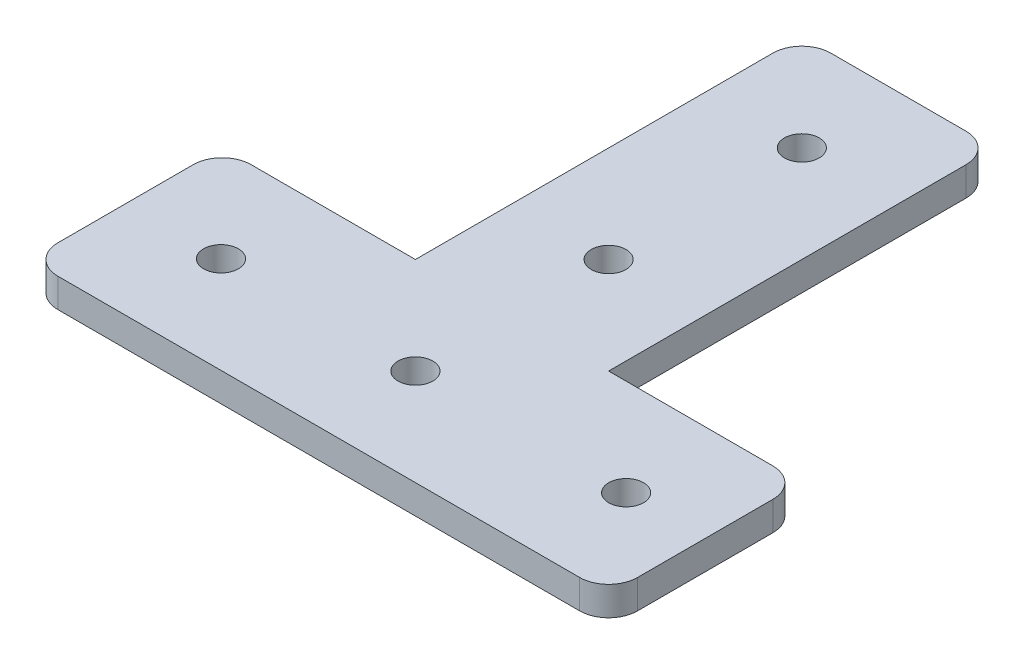
ISO-10303-21;
HEADER;
FILE_DESCRIPTION(('STEP AP214'),'2;1');
FILE_NAME('part.step','',(''),(''),'','','');
FILE_SCHEMA(('AUTOMOTIVE_DESIGN { 1 0 10303 214 1 1 1 1 }'));
ENDSEC;
DATA;
#1=APPLICATION_CONTEXT('core data for automotive mechanical design processes');
#2=APPLICATION_PROTOCOL_DEFINITION('international standard','automotive_design',2000,#1);
#3=PRODUCT_CONTEXT('',#1,'mechanical');
#4=PRODUCT('Part','Part','',(#3));
#5=PRODUCT_RELATED_PRODUCT_CATEGORY('part','',(#4));
#6=PRODUCT_DEFINITION_FORMATION('','',#4);
#7=PRODUCT_DEFINITION_CONTEXT('part definition',#1,'design');
#8=PRODUCT_DEFINITION('design','',#6,#7);
#9=PRODUCT_DEFINITION_SHAPE('','',#8);
#10=(LENGTH_UNIT() NAMED_UNIT(*) SI_UNIT(.MILLI.,.METRE.));
#11=(NAMED_UNIT(*) PLANE_ANGLE_UNIT() SI_UNIT($,.RADIAN.));
#12=(NAMED_UNIT(*) SI_UNIT($,.STERADIAN.) SOLID_ANGLE_UNIT());
#13=UNCERTAINTY_MEASURE_WITH_UNIT(LENGTH_MEASURE(1.E-05),#10,'distance_accuracy_value','');
#14=(GEOMETRIC_REPRESENTATION_CONTEXT(3) GLOBAL_UNCERTAINTY_ASSIGNED_CONTEXT((#13)) GLOBAL_UNIT_ASSIGNED_CONTEXT((#10,
#11,#12)) REPRESENTATION_CONTEXT('',''));
#15=CARTESIAN_POINT('',(0.,0.,0.));
#16=DIRECTION('',(0.,0.,1.));
#17=DIRECTION('',(1.,0.,0.));
#18=AXIS2_PLACEMENT_3D('',#15,#16,#17);
#19=CARTESIAN_POINT('',(10.,3.,0.));
#20=DIRECTION('',(1.,0.,0.));
#21=DIRECTION('',(0.,0.,-1.));
#22=AXIS2_PLACEMENT_3D('',#19,#20,#21);
#23=PLANE('',#22);
#24=DIRECTION('',(0.,0.,1.));
#25=VECTOR('',#24,1.);
#26=CARTESIAN_POINT('',(10.,0.,0.));
#27=LINE('',#26,#25);
#28=CARTESIAN_POINT('',(10.,0.,-47.));
#29=VERTEX_POINT('',#28);
#30=CARTESIAN_POINT('',(10.,0.,-10.));
#31=VERTEX_POINT('',#30);
#32=EDGE_CURVE('E351',#29,#31,#27,.T.);
#33=ORIENTED_EDGE('',*,*,#32,.F.);
#34=DIRECTION('',(0.,-1.,0.));
#35=VECTOR('',#34,1.);
#36=CARTESIAN_POINT('',(10.,3.,-47.));
#37=LINE('',#36,#35);
#38=CARTESIAN_POINT('',(10.,3.,-47.));
#39=VERTEX_POINT('',#38);
#40=EDGE_CURVE('E214',#29,#39,#37,.F.);
#41=ORIENTED_EDGE('',*,*,#40,.T.);
#42=DIRECTION('',(0.,0.,1.));
#43=VECTOR('',#42,1.);
#44=CARTESIAN_POINT('',(10.,3.,0.));
#45=LINE('',#44,#43);
#46=CARTESIAN_POINT('',(10.,3.,-10.));
#47=VERTEX_POINT('',#46);
#48=EDGE_CURVE('E317',#39,#47,#45,.T.);
#49=ORIENTED_EDGE('',*,*,#48,.T.);
#50=DIRECTION('',(0.,-1.,0.));
#51=VECTOR('',#50,1.);
#52=CARTESIAN_POINT('',(10.,3.,-10.));
#53=LINE('',#52,#51);
#54=EDGE_CURVE('E181',#47,#31,#53,.T.);
#55=ORIENTED_EDGE('',*,*,#54,.T.);
#56=EDGE_LOOP('',(#33,#41,#49,#55));
#57=FACE_BOUND('',#56,.T.);
#58=ADVANCED_FACE('F50',(#57),#23,.T.);
#59=CARTESIAN_POINT('',(0.,3.,-50.));
#60=DIRECTION('',(0.,0.,-1.));
#61=DIRECTION('',(-1.,0.,0.));
#62=AXIS2_PLACEMENT_3D('',#59,#60,#61);
#63=PLANE('',#62);
#64=DIRECTION('',(1.,0.,0.));
#65=VECTOR('',#64,1.);
#66=CARTESIAN_POINT('',(0.,3.,-50.));
#67=LINE('',#66,#65);
#68=CARTESIAN_POINT('',(-7.,3.,-50.));
#69=VERTEX_POINT('',#68);
#70=CARTESIAN_POINT('',(7.,3.,-50.));
#71=VERTEX_POINT('',#70);
#72=EDGE_CURVE('E175',#69,#71,#67,.T.);
#73=ORIENTED_EDGE('',*,*,#72,.T.);
#74=DIRECTION('',(0.,-1.,0.));
#75=VECTOR('',#74,1.);
#76=CARTESIAN_POINT('',(7.,3.,-50.));
#77=LINE('',#76,#75);
#78=CARTESIAN_POINT('',(7.,0.,-50.));
#79=VERTEX_POINT('',#78);
#80=EDGE_CURVE('E187',#71,#79,#77,.T.);
#81=ORIENTED_EDGE('',*,*,#80,.T.);
#82=DIRECTION('',(1.,0.,0.));
#83=VECTOR('',#82,1.);
#84=CARTESIAN_POINT('',(0.,0.,-50.));
#85=LINE('',#84,#83);
#86=CARTESIAN_POINT('',(-7.,0.,-50.));
#87=VERTEX_POINT('',#86);
#88=EDGE_CURVE('E353',#87,#79,#85,.T.);
#89=ORIENTED_EDGE('',*,*,#88,.F.);
#90=DIRECTION('',(0.,-1.,0.));
#91=VECTOR('',#90,1.);
#92=CARTESIAN_POINT('',(-7.,3.,-50.));
#93=LINE('',#92,#91);
#94=EDGE_CURVE('E185',#87,#69,#93,.F.);
#95=ORIENTED_EDGE('',*,*,#94,.T.);
#96=EDGE_LOOP('',(#73,#81,#89,#95));
#97=FACE_BOUND('',#96,.T.);
#98=ADVANCED_FACE('F385',(#97),#63,.T.);
#99=CARTESIAN_POINT('',(-10.,3.,0.));
#100=DIRECTION('',(1.,0.,0.));
#101=DIRECTION('',(0.,0.,-1.));
#102=AXIS2_PLACEMENT_3D('',#99,#100,#101);
#103=PLANE('',#102);
#104=DIRECTION('',(0.,0.,1.));
#105=VECTOR('',#104,1.);
#106=CARTESIAN_POINT('',(-10.,3.,0.));
#107=LINE('',#106,#105);
#108=CARTESIAN_POINT('',(-10.,3.,-47.));
#109=VERTEX_POINT('',#108);
#110=CARTESIAN_POINT('',(-10.,3.,-10.));
#111=VERTEX_POINT('',#110);
#112=EDGE_CURVE('E165',#109,#111,#107,.T.);
#113=ORIENTED_EDGE('',*,*,#112,.F.);
#114=DIRECTION('',(0.,-1.,0.));
#115=VECTOR('',#114,1.);
#116=CARTESIAN_POINT('',(-10.,0.,-47.));
#117=LINE('',#116,#115);
#118=CARTESIAN_POINT('',(-10.,0.,-47.));
#119=VERTEX_POINT('',#118);
#120=EDGE_CURVE('E11',#109,#119,#117,.T.);
#121=ORIENTED_EDGE('',*,*,#120,.T.);
#122=DIRECTION('',(0.,0.,1.));
#123=VECTOR('',#122,1.);
#124=CARTESIAN_POINT('',(-10.,0.,0.));
#125=LINE('',#124,#123);
#126=CARTESIAN_POINT('',(-10.,0.,-10.));
#127=VERTEX_POINT('',#126);
#128=EDGE_CURVE('E177',#119,#127,#125,.T.);
#129=ORIENTED_EDGE('',*,*,#128,.T.);
#130=DIRECTION('',(0.,-1.,0.));
#131=VECTOR('',#130,1.);
#132=CARTESIAN_POINT('',(-10.,3.,-10.));
#133=LINE('',#132,#131);
#134=EDGE_CURVE('E160',#111,#127,#133,.T.);
#135=ORIENTED_EDGE('',*,*,#134,.F.);
#136=EDGE_LOOP('',(#113,#121,#129,#135));
#137=FACE_BOUND('',#136,.T.);
#138=ADVANCED_FACE('F180',(#137),#103,.F.);
#139=CARTESIAN_POINT('',(0.,3.,-10.));
#140=DIRECTION('',(0.,0.,-1.));
#141=DIRECTION('',(-1.,0.,0.));
#142=AXIS2_PLACEMENT_3D('',#139,#140,#141);
#143=PLANE('',#142);
#144=DIRECTION('',(1.,0.,0.));
#145=VECTOR('',#144,1.);
#146=CARTESIAN_POINT('',(0.,0.,-10.));
#147=LINE('',#146,#145);
#148=CARTESIAN_POINT('',(-27.,0.,-10.));
#149=VERTEX_POINT('',#148);
#150=EDGE_CURVE('E294',#149,#127,#147,.T.);
#151=ORIENTED_EDGE('',*,*,#150,.F.);
#152=DIRECTION('',(0.,-1.,0.));
#153=VECTOR('',#152,1.);
#154=CARTESIAN_POINT('',(-27.,3.,-10.));
#155=LINE('',#154,#153);
#156=CARTESIAN_POINT('',(-27.,3.,-10.));
#157=VERTEX_POINT('',#156);
#158=EDGE_CURVE('E57',#149,#157,#155,.F.);
#159=ORIENTED_EDGE('',*,*,#158,.T.);
#160=DIRECTION('',(1.,0.,0.));
#161=VECTOR('',#160,1.);
#162=CARTESIAN_POINT('',(0.,3.,-10.));
#163=LINE('',#162,#161);
#164=EDGE_CURVE('E155',#157,#111,#163,.T.);
#165=ORIENTED_EDGE('',*,*,#164,.T.);
#166=ORIENTED_EDGE('',*,*,#134,.T.);
#167=EDGE_LOOP('',(#151,#159,#165,#166));
#168=FACE_BOUND('',#167,.T.);
#169=ADVANCED_FACE('F154',(#168),#143,.T.);
#170=CARTESIAN_POINT('',(-30.,3.,0.));
#171=DIRECTION('',(-1.,0.,0.));
#172=DIRECTION('',(0.,0.,1.));
#173=AXIS2_PLACEMENT_3D('',#170,#171,#172);
#174=PLANE('',#173);
#175=DIRECTION('',(0.,0.,-1.));
#176=VECTOR('',#175,1.);
#177=CARTESIAN_POINT('',(-30.,0.,0.));
#178=LINE('',#177,#176);
#179=CARTESIAN_POINT('',(-30.,0.,7.));
#180=VERTEX_POINT('',#179);
#181=CARTESIAN_POINT('',(-30.,0.,-7.));
#182=VERTEX_POINT('',#181);
#183=EDGE_CURVE('E266',#180,#182,#178,.T.);
#184=ORIENTED_EDGE('',*,*,#183,.F.);
#185=DIRECTION('',(0.,-1.,0.));
#186=VECTOR('',#185,1.);
#187=CARTESIAN_POINT('',(-30.,3.,7.));
#188=LINE('',#187,#186);
#189=CARTESIAN_POINT('',(-30.,3.,7.));
#190=VERTEX_POINT('',#189);
#191=EDGE_CURVE('E254',#180,#190,#188,.F.);
#192=ORIENTED_EDGE('',*,*,#191,.T.);
#193=DIRECTION('',(0.,0.,-1.));
#194=VECTOR('',#193,1.);
#195=CARTESIAN_POINT('',(-30.,3.,0.));
#196=LINE('',#195,#194);
#197=CARTESIAN_POINT('',(-30.,3.,-7.));
#198=VERTEX_POINT('',#197);
#199=EDGE_CURVE('E161',#190,#198,#196,.T.);
#200=ORIENTED_EDGE('',*,*,#199,.T.);
#201=DIRECTION('',(0.,-1.,0.));
#202=VECTOR('',#201,1.);
#203=CARTESIAN_POINT('',(-30.,3.,-7.));
#204=LINE('',#203,#202);
#205=EDGE_CURVE('E253',#198,#182,#204,.T.);
#206=ORIENTED_EDGE('',*,*,#205,.T.);
#207=EDGE_LOOP('',(#184,#192,#200,#206));
#208=FACE_BOUND('',#207,.T.);
#209=ADVANCED_FACE('F263',(#208),#174,.T.);
#210=CARTESIAN_POINT('',(0.,3.,10.));
#211=DIRECTION('',(0.,0.,-1.));
#212=DIRECTION('',(-1.,0.,0.));
#213=AXIS2_PLACEMENT_3D('',#210,#211,#212);
#214=PLANE('',#213);
#215=DIRECTION('',(1.,0.,0.));
#216=VECTOR('',#215,1.);
#217=CARTESIAN_POINT('',(0.,0.,10.));
#218=LINE('',#217,#216);
#219=CARTESIAN_POINT('',(-27.,0.,10.));
#220=VERTEX_POINT('',#219);
#221=CARTESIAN_POINT('',(27.,0.,10.));
#222=VERTEX_POINT('',#221);
#223=EDGE_CURVE('E278',#220,#222,#218,.T.);
#224=ORIENTED_EDGE('',*,*,#223,.T.);
#225=DIRECTION('',(0.,-1.,0.));
#226=VECTOR('',#225,1.);
#227=CARTESIAN_POINT('',(27.,3.,10.));
#228=LINE('',#227,#226);
#229=CARTESIAN_POINT('',(27.,3.,10.));
#230=VERTEX_POINT('',#229);
#231=EDGE_CURVE('E248',#222,#230,#228,.F.);
#232=ORIENTED_EDGE('',*,*,#231,.T.);
#233=DIRECTION('',(1.,0.,0.));
#234=VECTOR('',#233,1.);
#235=CARTESIAN_POINT('',(0.,3.,10.));
#236=LINE('',#235,#234);
#237=CARTESIAN_POINT('',(-27.,3.,10.));
#238=VERTEX_POINT('',#237);
#239=EDGE_CURVE('E275',#238,#230,#236,.T.);
#240=ORIENTED_EDGE('',*,*,#239,.F.);
#241=DIRECTION('',(0.,-1.,0.));
#242=VECTOR('',#241,1.);
#243=CARTESIAN_POINT('',(-27.,0.,10.));
#244=LINE('',#243,#242);
#245=EDGE_CURVE('E243',#238,#220,#244,.T.);
#246=ORIENTED_EDGE('',*,*,#245,.T.);
#247=EDGE_LOOP('',(#224,#232,#240,#246));
#248=FACE_BOUND('',#247,.T.);
#249=ADVANCED_FACE('F276',(#248),#214,.F.);
#250=CARTESIAN_POINT('',(30.,3.,0.));
#251=DIRECTION('',(-1.,0.,0.));
#252=DIRECTION('',(0.,0.,1.));
#253=AXIS2_PLACEMENT_3D('',#250,#251,#252);
#254=PLANE('',#253);
#255=DIRECTION('',(0.,0.,-1.));
#256=VECTOR('',#255,1.);
#257=CARTESIAN_POINT('',(30.,0.,0.));
#258=LINE('',#257,#256);
#259=CARTESIAN_POINT('',(30.,0.,7.));
#260=VERTEX_POINT('',#259);
#261=CARTESIAN_POINT('',(30.,0.,-7.));
#262=VERTEX_POINT('',#261);
#263=EDGE_CURVE('E288',#260,#262,#258,.T.);
#264=ORIENTED_EDGE('',*,*,#263,.T.);
#265=DIRECTION('',(0.,-1.,0.));
#266=VECTOR('',#265,1.);
#267=CARTESIAN_POINT('',(30.,3.,-7.));
#268=LINE('',#267,#266);
#269=CARTESIAN_POINT('',(30.,3.,-7.));
#270=VERTEX_POINT('',#269);
#271=EDGE_CURVE('E72',#262,#270,#268,.F.);
#272=ORIENTED_EDGE('',*,*,#271,.T.);
#273=DIRECTION('',(0.,0.,-1.));
#274=VECTOR('',#273,1.);
#275=CARTESIAN_POINT('',(30.,3.,0.));
#276=LINE('',#275,#274);
#277=CARTESIAN_POINT('',(30.,3.,7.));
#278=VERTEX_POINT('',#277);
#279=EDGE_CURVE('E328',#278,#270,#276,.T.);
#280=ORIENTED_EDGE('',*,*,#279,.F.);
#281=DIRECTION('',(0.,-1.,0.));
#282=VECTOR('',#281,1.);
#283=CARTESIAN_POINT('',(30.,3.,7.));
#284=LINE('',#283,#282);
#285=EDGE_CURVE('E236',#278,#260,#284,.T.);
#286=ORIENTED_EDGE('',*,*,#285,.T.);
#287=EDGE_LOOP('',(#264,#272,#280,#286));
#288=FACE_BOUND('',#287,.T.);
#289=ADVANCED_FACE('F425',(#288),#254,.F.);
#290=CARTESIAN_POINT('',(-20.1228069286661,3.,0.));
#291=DIRECTION('',(0.,-1.,0.));
#292=DIRECTION('',(0.,0.,-1.));
#293=AXIS2_PLACEMENT_3D('',#290,#291,#292);
#294=CYLINDRICAL_SURFACE('',#293,1.8);
#295=CARTESIAN_POINT('',(-20.1228069286661,3.,0.));
#296=DIRECTION('',(0.,1.,0.));
#297=DIRECTION('',(0.,0.,1.));
#298=AXIS2_PLACEMENT_3D('',#295,#296,#297);
#299=CIRCLE('',#298,1.8);
#300=CARTESIAN_POINT('',(-20.1228069286661,3.,1.8));
#301=VERTEX_POINT('',#300);
#302=EDGE_CURVE('E336',#301,#301,#299,.T.);
#303=ORIENTED_EDGE('',*,*,#302,.T.);
#304=EDGE_LOOP('',(#303));
#305=FACE_BOUND('',#304,.T.);
#306=CARTESIAN_POINT('',(-20.1228069286661,0.,0.));
#307=DIRECTION('',(0.,1.,0.));
#308=DIRECTION('',(0.,0.,1.));
#309=AXIS2_PLACEMENT_3D('',#306,#307,#308);
#310=CIRCLE('',#309,1.8);
#311=CARTESIAN_POINT('',(-20.1228069286661,0.,1.8));
#312=VERTEX_POINT('',#311);
#313=EDGE_CURVE('E305',#312,#312,#310,.T.);
#314=ORIENTED_EDGE('',*,*,#313,.F.);
#315=EDGE_LOOP('',(#314));
#316=FACE_BOUND('',#315,.T.);
#317=ADVANCED_FACE('F416',(#305,#316),#294,.F.);
#318=CARTESIAN_POINT('',(0.,3.,0.));
#319=DIRECTION('',(0.,-1.,0.));
#320=DIRECTION('',(0.,0.,-1.));
#321=AXIS2_PLACEMENT_3D('',#318,#319,#320);
#322=CYLINDRICAL_SURFACE('',#321,1.8);
#323=CARTESIAN_POINT('',(0.,3.,0.));
#324=DIRECTION('',(0.,1.,0.));
#325=DIRECTION('',(0.,0.,1.));
#326=AXIS2_PLACEMENT_3D('',#323,#324,#325);
#327=CIRCLE('',#326,1.8);
#328=CARTESIAN_POINT('',(0.,3.,1.8));
#329=VERTEX_POINT('',#328);
#330=EDGE_CURVE('E335',#329,#329,#327,.T.);
#331=ORIENTED_EDGE('',*,*,#330,.T.);
#332=EDGE_LOOP('',(#331));
#333=FACE_BOUND('',#332,.T.);
#334=CARTESIAN_POINT('',(0.,0.,0.));
#335=DIRECTION('',(0.,1.,0.));
#336=DIRECTION('',(0.,0.,1.));
#337=AXIS2_PLACEMENT_3D('',#334,#335,#336);
#338=CIRCLE('',#337,1.8);
#339=CARTESIAN_POINT('',(0.,0.,1.8));
#340=VERTEX_POINT('',#339);
#341=EDGE_CURVE('E299',#340,#340,#338,.T.);
#342=ORIENTED_EDGE('',*,*,#341,.F.);
#343=EDGE_LOOP('',(#342));
#344=FACE_BOUND('',#343,.T.);
#345=ADVANCED_FACE('F423',(#333,#344),#322,.F.);
#346=CARTESIAN_POINT('',(27.,3.,-10.));
#347=VERTEX_POINT('',#346);
#348=EDGE_CURVE('E163',#47,#347,#163,.T.);
#349=ORIENTED_EDGE('',*,*,#348,.T.);
#350=DIRECTION('',(0.,-1.,0.));
#351=VECTOR('',#350,1.);
#352=CARTESIAN_POINT('',(27.,0.,-10.));
#353=LINE('',#352,#351);
#354=CARTESIAN_POINT('',(27.,0.,-10.));
#355=VERTEX_POINT('',#354);
#356=EDGE_CURVE('E232',#347,#355,#353,.T.);
#357=ORIENTED_EDGE('',*,*,#356,.T.);
#358=EDGE_CURVE('E295',#31,#355,#147,.T.);
#359=ORIENTED_EDGE('',*,*,#358,.F.);
#360=ORIENTED_EDGE('',*,*,#54,.F.);
#361=EDGE_LOOP('',(#349,#357,#359,#360));
#362=FACE_BOUND('',#361,.T.);
#363=ADVANCED_FACE('F364',(#362),#143,.T.);
#364=CARTESIAN_POINT('',(0.,3.,-40.));
#365=DIRECTION('',(0.,-1.,0.));
#366=DIRECTION('',(0.,0.,-1.));
#367=AXIS2_PLACEMENT_3D('',#364,#365,#366);
#368=CYLINDRICAL_SURFACE('',#367,1.8);
#369=CARTESIAN_POINT('',(0.,3.,-40.));
#370=DIRECTION('',(0.,1.,0.));
#371=DIRECTION('',(0.,0.,1.));
#372=AXIS2_PLACEMENT_3D('',#369,#370,#371);
#373=CIRCLE('',#372,1.8);
#374=CARTESIAN_POINT('',(0.,3.,-38.2));
#375=VERTEX_POINT('',#374);
#376=EDGE_CURVE('E311',#375,#375,#373,.T.);
#377=ORIENTED_EDGE('',*,*,#376,.T.);
#378=EDGE_LOOP('',(#377));
#379=FACE_BOUND('',#378,.T.);
#380=CARTESIAN_POINT('',(0.,0.,-40.));
#381=DIRECTION('',(0.,1.,0.));
#382=DIRECTION('',(0.,0.,1.));
#383=AXIS2_PLACEMENT_3D('',#380,#381,#382);
#384=CIRCLE('',#383,1.8);
#385=CARTESIAN_POINT('',(0.,0.,-38.2));
#386=VERTEX_POINT('',#385);
#387=EDGE_CURVE('E350',#386,#386,#384,.T.);
#388=ORIENTED_EDGE('',*,*,#387,.F.);
#389=EDGE_LOOP('',(#388));
#390=FACE_BOUND('',#389,.T.);
#391=ADVANCED_FACE('F394',(#379,#390),#368,.F.);
#392=CARTESIAN_POINT('',(0.,3.,-20.));
#393=DIRECTION('',(0.,-1.,0.));
#394=DIRECTION('',(0.,0.,-1.));
#395=AXIS2_PLACEMENT_3D('',#392,#393,#394);
#396=CYLINDRICAL_SURFACE('',#395,1.8);
#397=CARTESIAN_POINT('',(0.,3.,-20.));
#398=DIRECTION('',(0.,1.,0.));
#399=DIRECTION('',(0.,0.,1.));
#400=AXIS2_PLACEMENT_3D('',#397,#398,#399);
#401=CIRCLE('',#400,1.8);
#402=CARTESIAN_POINT('',(0.,3.,-18.2));
#403=VERTEX_POINT('',#402);
#404=EDGE_CURVE('E306',#403,#403,#401,.T.);
#405=ORIENTED_EDGE('',*,*,#404,.T.);
#406=EDGE_LOOP('',(#405));
#407=FACE_BOUND('',#406,.T.);
#408=CARTESIAN_POINT('',(0.,0.,-20.));
#409=DIRECTION('',(0.,1.,0.));
#410=DIRECTION('',(0.,0.,1.));
#411=AXIS2_PLACEMENT_3D('',#408,#409,#410);
#412=CIRCLE('',#411,1.8);
#413=CARTESIAN_POINT('',(0.,0.,-18.2));
#414=VERTEX_POINT('',#413);
#415=EDGE_CURVE('E343',#414,#414,#412,.T.);
#416=ORIENTED_EDGE('',*,*,#415,.F.);
#417=EDGE_LOOP('',(#416));
#418=FACE_BOUND('',#417,.T.);
#419=ADVANCED_FACE('F396',(#407,#418),#396,.F.);
#420=CARTESIAN_POINT('',(21.8128257629646,3.,0.));
#421=DIRECTION('',(0.,-1.,0.));
#422=DIRECTION('',(0.,0.,-1.));
#423=AXIS2_PLACEMENT_3D('',#420,#421,#422);
#424=CYLINDRICAL_SURFACE('',#423,1.8);
#425=CARTESIAN_POINT('',(21.8128257629646,3.,0.));
#426=DIRECTION('',(0.,1.,0.));
#427=DIRECTION('',(0.,0.,1.));
#428=AXIS2_PLACEMENT_3D('',#425,#426,#427);
#429=CIRCLE('',#428,1.8);
#430=CARTESIAN_POINT('',(21.8128257629646,3.,1.8));
#431=VERTEX_POINT('',#430);
#432=EDGE_CURVE('E190',#431,#431,#429,.T.);
#433=ORIENTED_EDGE('',*,*,#432,.T.);
#434=EDGE_LOOP('',(#433));
#435=FACE_BOUND('',#434,.T.);
#436=CARTESIAN_POINT('',(21.8128257629646,0.,0.));
#437=DIRECTION('',(0.,1.,0.));
#438=DIRECTION('',(0.,0.,1.));
#439=AXIS2_PLACEMENT_3D('',#436,#437,#438);
#440=CIRCLE('',#439,1.8);
#441=CARTESIAN_POINT('',(21.8128257629646,0.,1.8));
#442=VERTEX_POINT('',#441);
#443=EDGE_CURVE('E304',#442,#442,#440,.T.);
#444=ORIENTED_EDGE('',*,*,#443,.F.);
#445=EDGE_LOOP('',(#444));
#446=FACE_BOUND('',#445,.T.);
#447=ADVANCED_FACE('F397',(#435,#446),#424,.F.);
#448=CARTESIAN_POINT('',(0.,3.,0.));
#449=DIRECTION('',(0.,1.,0.));
#450=DIRECTION('',(0.,0.,1.));
#451=AXIS2_PLACEMENT_3D('',#448,#449,#450);
#452=PLANE('',#451);
#453=ORIENTED_EDGE('',*,*,#404,.F.);
#454=EDGE_LOOP('',(#453));
#455=FACE_BOUND('',#454,.T.);
#456=ORIENTED_EDGE('',*,*,#376,.F.);
#457=EDGE_LOOP('',(#456));
#458=FACE_BOUND('',#457,.T.);
#459=ORIENTED_EDGE('',*,*,#48,.F.);
#460=CARTESIAN_POINT('',(7.,3.,-47.));
#461=DIRECTION('',(0.,1.,0.));
#462=DIRECTION('',(0.,0.,1.));
#463=AXIS2_PLACEMENT_3D('',#460,#461,#462);
#464=CIRCLE('',#463,3.);
#465=EDGE_CURVE('E231',#39,#71,#464,.T.);
#466=ORIENTED_EDGE('',*,*,#465,.T.);
#467=ORIENTED_EDGE('',*,*,#72,.F.);
#468=CARTESIAN_POINT('',(-7.,3.,-47.));
#469=DIRECTION('',(0.,1.,0.));
#470=DIRECTION('',(0.,0.,1.));
#471=AXIS2_PLACEMENT_3D('',#468,#469,#470);
#472=CIRCLE('',#471,3.);
#473=EDGE_CURVE('E171',#69,#109,#472,.T.);
#474=ORIENTED_EDGE('',*,*,#473,.T.);
#475=ORIENTED_EDGE('',*,*,#112,.T.);
#476=ORIENTED_EDGE('',*,*,#164,.F.);
#477=CARTESIAN_POINT('',(-27.,3.,-7.));
#478=DIRECTION('',(0.,1.,0.));
#479=DIRECTION('',(0.,0.,1.));
#480=AXIS2_PLACEMENT_3D('',#477,#478,#479);
#481=CIRCLE('',#480,3.);
#482=EDGE_CURVE('E219',#157,#198,#481,.T.);
#483=ORIENTED_EDGE('',*,*,#482,.T.);
#484=ORIENTED_EDGE('',*,*,#199,.F.);
#485=CARTESIAN_POINT('',(-27.,3.,7.));
#486=DIRECTION('',(0.,1.,0.));
#487=DIRECTION('',(0.,0.,1.));
#488=AXIS2_PLACEMENT_3D('',#485,#486,#487);
#489=CIRCLE('',#488,3.);
#490=EDGE_CURVE('E224',#190,#238,#489,.T.);
#491=ORIENTED_EDGE('',*,*,#490,.T.);
#492=ORIENTED_EDGE('',*,*,#239,.T.);
#493=CARTESIAN_POINT('',(27.,3.,7.));
#494=DIRECTION('',(0.,1.,0.));
#495=DIRECTION('',(0.,0.,1.));
#496=AXIS2_PLACEMENT_3D('',#493,#494,#495);
#497=CIRCLE('',#496,3.);
#498=EDGE_CURVE('E226',#230,#278,#497,.T.);
#499=ORIENTED_EDGE('',*,*,#498,.T.);
#500=ORIENTED_EDGE('',*,*,#279,.T.);
#501=CARTESIAN_POINT('',(27.,3.,-7.));
#502=DIRECTION('',(0.,1.,0.));
#503=DIRECTION('',(0.,0.,1.));
#504=AXIS2_PLACEMENT_3D('',#501,#502,#503);
#505=CIRCLE('',#504,3.);
#506=EDGE_CURVE('E64',#270,#347,#505,.T.);
#507=ORIENTED_EDGE('',*,*,#506,.T.);
#508=ORIENTED_EDGE('',*,*,#348,.F.);
#509=EDGE_LOOP('',(#459,#466,#467,#474,#475,#476,#483,#484,#491,#492,#499,#500,#507,#508));
#510=FACE_BOUND('',#509,.T.);
#511=ORIENTED_EDGE('',*,*,#330,.F.);
#512=EDGE_LOOP('',(#511));
#513=FACE_BOUND('',#512,.T.);
#514=ORIENTED_EDGE('',*,*,#302,.F.);
#515=EDGE_LOOP('',(#514));
#516=FACE_BOUND('',#515,.T.);
#517=ORIENTED_EDGE('',*,*,#432,.F.);
#518=EDGE_LOOP('',(#517));
#519=FACE_BOUND('',#518,.T.);
#520=ADVANCED_FACE('F170',(#455,#458,#510,#513,#516,#519),#452,.T.);
#521=CARTESIAN_POINT('',(0.,0.,0.));
#522=DIRECTION('',(0.,1.,0.));
#523=DIRECTION('',(0.,0.,1.));
#524=AXIS2_PLACEMENT_3D('',#521,#522,#523);
#525=PLANE('',#524);
#526=ORIENTED_EDGE('',*,*,#415,.T.);
#527=EDGE_LOOP('',(#526));
#528=FACE_BOUND('',#527,.T.);
#529=ORIENTED_EDGE('',*,*,#387,.T.);
#530=EDGE_LOOP('',(#529));
#531=FACE_BOUND('',#530,.T.);
#532=ORIENTED_EDGE('',*,*,#88,.T.);
#533=CARTESIAN_POINT('',(7.,0.,-47.));
#534=DIRECTION('',(0.,1.,0.));
#535=DIRECTION('',(0.,0.,1.));
#536=AXIS2_PLACEMENT_3D('',#533,#534,#535);
#537=CIRCLE('',#536,3.);
#538=EDGE_CURVE('E215',#79,#29,#537,.F.);
#539=ORIENTED_EDGE('',*,*,#538,.T.);
#540=ORIENTED_EDGE('',*,*,#32,.T.);
#541=ORIENTED_EDGE('',*,*,#358,.T.);
#542=CARTESIAN_POINT('',(27.,0.,-7.));
#543=DIRECTION('',(0.,1.,0.));
#544=DIRECTION('',(0.,0.,1.));
#545=AXIS2_PLACEMENT_3D('',#542,#543,#544);
#546=CIRCLE('',#545,3.);
#547=EDGE_CURVE('E207',#355,#262,#546,.F.);
#548=ORIENTED_EDGE('',*,*,#547,.T.);
#549=ORIENTED_EDGE('',*,*,#263,.F.);
#550=CARTESIAN_POINT('',(27.,0.,7.));
#551=DIRECTION('',(0.,1.,0.));
#552=DIRECTION('',(0.,0.,1.));
#553=AXIS2_PLACEMENT_3D('',#550,#551,#552);
#554=CIRCLE('',#553,3.);
#555=EDGE_CURVE('E206',#260,#222,#554,.F.);
#556=ORIENTED_EDGE('',*,*,#555,.T.);
#557=ORIENTED_EDGE('',*,*,#223,.F.);
#558=CARTESIAN_POINT('',(-27.,0.,7.));
#559=DIRECTION('',(0.,1.,0.));
#560=DIRECTION('',(0.,0.,1.));
#561=AXIS2_PLACEMENT_3D('',#558,#559,#560);
#562=CIRCLE('',#561,3.);
#563=EDGE_CURVE('E201',#220,#180,#562,.F.);
#564=ORIENTED_EDGE('',*,*,#563,.T.);
#565=ORIENTED_EDGE('',*,*,#183,.T.);
#566=CARTESIAN_POINT('',(-27.,0.,-7.));
#567=DIRECTION('',(0.,1.,0.));
#568=DIRECTION('',(0.,0.,1.));
#569=AXIS2_PLACEMENT_3D('',#566,#567,#568);
#570=CIRCLE('',#569,3.);
#571=EDGE_CURVE('E199',#182,#149,#570,.F.);
#572=ORIENTED_EDGE('',*,*,#571,.T.);
#573=ORIENTED_EDGE('',*,*,#150,.T.);
#574=ORIENTED_EDGE('',*,*,#128,.F.);
#575=CARTESIAN_POINT('',(-7.,0.,-47.));
#576=DIRECTION('',(0.,1.,0.));
#577=DIRECTION('',(0.,0.,1.));
#578=AXIS2_PLACEMENT_3D('',#575,#576,#577);
#579=CIRCLE('',#578,3.);
#580=EDGE_CURVE('E197',#119,#87,#579,.F.);
#581=ORIENTED_EDGE('',*,*,#580,.T.);
#582=EDGE_LOOP('',(#532,#539,#540,#541,#548,#549,#556,#557,#564,#565,#572,#573,#574,#581));
#583=FACE_BOUND('',#582,.T.);
#584=ORIENTED_EDGE('',*,*,#341,.T.);
#585=EDGE_LOOP('',(#584));
#586=FACE_BOUND('',#585,.T.);
#587=ORIENTED_EDGE('',*,*,#313,.T.);
#588=EDGE_LOOP('',(#587));
#589=FACE_BOUND('',#588,.T.);
#590=ORIENTED_EDGE('',*,*,#443,.T.);
#591=EDGE_LOOP('',(#590));
#592=FACE_BOUND('',#591,.T.);
#593=ADVANCED_FACE('F283',(#528,#531,#583,#586,#589,#592),#525,.F.);
#594=CARTESIAN_POINT('',(7.,3.,-47.));
#595=DIRECTION('',(0.,-1.,0.));
#596=DIRECTION('',(0.,0.,-1.));
#597=AXIS2_PLACEMENT_3D('',#594,#595,#596);
#598=CYLINDRICAL_SURFACE('',#597,3.);
#599=ORIENTED_EDGE('',*,*,#465,.F.);
#600=ORIENTED_EDGE('',*,*,#40,.F.);
#601=ORIENTED_EDGE('',*,*,#538,.F.);
#602=ORIENTED_EDGE('',*,*,#80,.F.);
#603=EDGE_LOOP('',(#599,#600,#601,#602));
#604=FACE_BOUND('',#603,.T.);
#605=ADVANCED_FACE('F371',(#604),#598,.T.);
#606=CARTESIAN_POINT('',(27.,3.,-7.));
#607=DIRECTION('',(0.,1.,0.));
#608=DIRECTION('',(0.,0.,1.));
#609=AXIS2_PLACEMENT_3D('',#606,#607,#608);
#610=CYLINDRICAL_SURFACE('',#609,3.);
#611=ORIENTED_EDGE('',*,*,#506,.F.);
#612=ORIENTED_EDGE('',*,*,#271,.F.);
#613=ORIENTED_EDGE('',*,*,#547,.F.);
#614=ORIENTED_EDGE('',*,*,#356,.F.);
#615=EDGE_LOOP('',(#611,#612,#613,#614));
#616=FACE_BOUND('',#615,.T.);
#617=ADVANCED_FACE('F366',(#616),#610,.T.);
#618=CARTESIAN_POINT('',(27.,3.,7.));
#619=DIRECTION('',(0.,-1.,0.));
#620=DIRECTION('',(0.,0.,-1.));
#621=AXIS2_PLACEMENT_3D('',#618,#619,#620);
#622=CYLINDRICAL_SURFACE('',#621,3.);
#623=ORIENTED_EDGE('',*,*,#498,.F.);
#624=ORIENTED_EDGE('',*,*,#231,.F.);
#625=ORIENTED_EDGE('',*,*,#555,.F.);
#626=ORIENTED_EDGE('',*,*,#285,.F.);
#627=EDGE_LOOP('',(#623,#624,#625,#626));
#628=FACE_BOUND('',#627,.T.);
#629=ADVANCED_FACE('F367',(#628),#622,.T.);
#630=CARTESIAN_POINT('',(-27.,3.,7.));
#631=DIRECTION('',(0.,1.,0.));
#632=DIRECTION('',(0.,0.,1.));
#633=AXIS2_PLACEMENT_3D('',#630,#631,#632);
#634=CYLINDRICAL_SURFACE('',#633,3.);
#635=ORIENTED_EDGE('',*,*,#490,.F.);
#636=ORIENTED_EDGE('',*,*,#191,.F.);
#637=ORIENTED_EDGE('',*,*,#563,.F.);
#638=ORIENTED_EDGE('',*,*,#245,.F.);
#639=EDGE_LOOP('',(#635,#636,#637,#638));
#640=FACE_BOUND('',#639,.T.);
#641=ADVANCED_FACE('F274',(#640),#634,.T.);
#642=CARTESIAN_POINT('',(-27.,3.,-7.));
#643=DIRECTION('',(0.,-1.,0.));
#644=DIRECTION('',(0.,0.,-1.));
#645=AXIS2_PLACEMENT_3D('',#642,#643,#644);
#646=CYLINDRICAL_SURFACE('',#645,3.);
#647=ORIENTED_EDGE('',*,*,#482,.F.);
#648=ORIENTED_EDGE('',*,*,#158,.F.);
#649=ORIENTED_EDGE('',*,*,#571,.F.);
#650=ORIENTED_EDGE('',*,*,#205,.F.);
#651=EDGE_LOOP('',(#647,#648,#649,#650));
#652=FACE_BOUND('',#651,.T.);
#653=ADVANCED_FACE('F504',(#652),#646,.T.);
#654=CARTESIAN_POINT('',(-7.,3.,-47.));
#655=DIRECTION('',(0.,1.,0.));
#656=DIRECTION('',(0.,0.,1.));
#657=AXIS2_PLACEMENT_3D('',#654,#655,#656);
#658=CYLINDRICAL_SURFACE('',#657,3.);
#659=ORIENTED_EDGE('',*,*,#473,.F.);
#660=ORIENTED_EDGE('',*,*,#94,.F.);
#661=ORIENTED_EDGE('',*,*,#580,.F.);
#662=ORIENTED_EDGE('',*,*,#120,.F.);
#663=EDGE_LOOP('',(#659,#660,#661,#662));
#664=FACE_BOUND('',#663,.T.);
#665=ADVANCED_FACE('F47',(#664),#658,.T.);
#666=CLOSED_SHELL('',(#58,#98,#138,#169,#209,#249,#289,#317,#345,#363,#391,#419,#447,#520,#593,
#605,#617,#629,#641,#653,#665));
#667=MANIFOLD_SOLID_BREP('B2',#666);
#668=ADVANCED_BREP_SHAPE_REPRESENTATION('',(#18,#667),#14);
#669=SHAPE_DEFINITION_REPRESENTATION(#9,#668);
ENDSEC;
END-ISO-10303-21;
